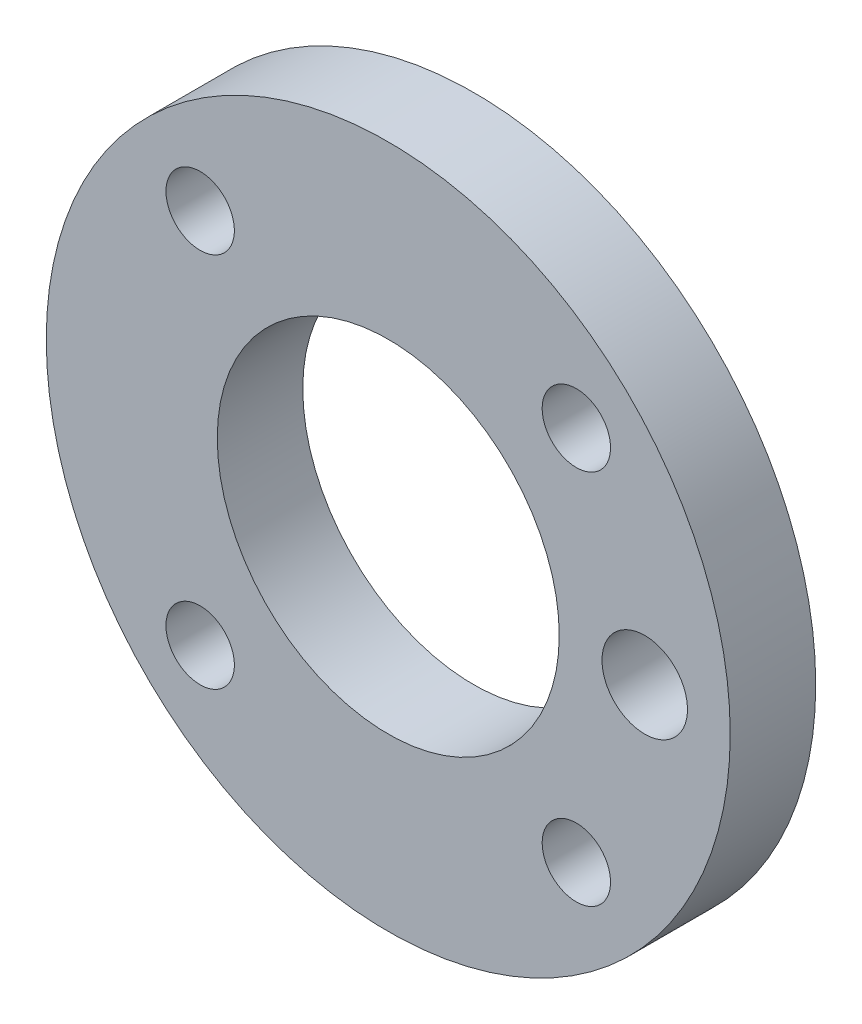
ISO-10303-21;
HEADER;
FILE_DESCRIPTION(('STEP AP214'),'2;1');
FILE_NAME('part.step','',(''),(''),'','','');
FILE_SCHEMA(('AUTOMOTIVE_DESIGN { 1 0 10303 214 1 1 1 1 }'));
ENDSEC;
DATA;
#1=APPLICATION_CONTEXT('core data for automotive mechanical design processes');
#2=APPLICATION_PROTOCOL_DEFINITION('international standard','automotive_design',2000,#1);
#3=PRODUCT_CONTEXT('',#1,'mechanical');
#4=PRODUCT('Part','Part','',(#3));
#5=PRODUCT_RELATED_PRODUCT_CATEGORY('part','',(#4));
#6=PRODUCT_DEFINITION_FORMATION('','',#4);
#7=PRODUCT_DEFINITION_CONTEXT('part definition',#1,'design');
#8=PRODUCT_DEFINITION('design','',#6,#7);
#9=PRODUCT_DEFINITION_SHAPE('','',#8);
#10=(LENGTH_UNIT() NAMED_UNIT(*) SI_UNIT(.MILLI.,.METRE.));
#11=(NAMED_UNIT(*) PLANE_ANGLE_UNIT() SI_UNIT($,.RADIAN.));
#12=(NAMED_UNIT(*) SI_UNIT($,.STERADIAN.) SOLID_ANGLE_UNIT());
#13=UNCERTAINTY_MEASURE_WITH_UNIT(LENGTH_MEASURE(1.E-05),#10,'distance_accuracy_value','');
#14=(GEOMETRIC_REPRESENTATION_CONTEXT(3) GLOBAL_UNCERTAINTY_ASSIGNED_CONTEXT((#13)) GLOBAL_UNIT_ASSIGNED_CONTEXT((#10,
#11,#12)) REPRESENTATION_CONTEXT('',''));
#15=CARTESIAN_POINT('',(0.,0.,0.));
#16=DIRECTION('',(0.,0.,1.));
#17=DIRECTION('',(1.,0.,0.));
#18=AXIS2_PLACEMENT_3D('',#15,#16,#17);
#19=CARTESIAN_POINT('',(0.,0.,5.));
#20=DIRECTION('',(0.,0.,1.));
#21=DIRECTION('',(-1.,0.,0.));
#22=AXIS2_PLACEMENT_3D('',#19,#20,#21);
#23=PLANE('',#22);
#24=CARTESIAN_POINT('',(-11.0000000000001,10.9999999999999,5.00000000000004));
#25=DIRECTION('',(0.,0.,1.));
#26=DIRECTION('',(-1.,0.,0.));
#27=AXIS2_PLACEMENT_3D('',#24,#25,#26);
#28=CIRCLE('',#27,2.);
#29=CARTESIAN_POINT('',(-13.0000000000001,10.9999999999999,5.00000000000005));
#30=VERTEX_POINT('',#29);
#31=EDGE_CURVE('E83',#30,#30,#28,.T.);
#32=ORIENTED_EDGE('',*,*,#31,.F.);
#33=EDGE_LOOP('',(#32));
#34=FACE_BOUND('',#33,.T.);
#35=CARTESIAN_POINT('',(15.,1.03163547985295E-13,4.99999999999995));
#36=DIRECTION('',(0.,0.,1.));
#37=DIRECTION('',(-1.,0.,0.));
#38=AXIS2_PLACEMENT_3D('',#35,#36,#37);
#39=CIRCLE('',#38,2.5);
#40=CARTESIAN_POINT('',(12.5,0.,4.99999999999996));
#41=VERTEX_POINT('',#40);
#42=EDGE_CURVE('E67',#41,#41,#39,.T.);
#43=ORIENTED_EDGE('',*,*,#42,.F.);
#44=EDGE_LOOP('',(#43));
#45=FACE_BOUND('',#44,.T.);
#46=CARTESIAN_POINT('',(0.,0.,5.));
#47=DIRECTION('',(0.,0.,1.));
#48=DIRECTION('',(-1.,0.,0.));
#49=AXIS2_PLACEMENT_3D('',#46,#47,#48);
#50=CIRCLE('',#49,10.);
#51=CARTESIAN_POINT('',(-9.99999999999998,0.,5.00000000000003));
#52=VERTEX_POINT('',#51);
#53=EDGE_CURVE('E53',#52,#52,#50,.T.);
#54=ORIENTED_EDGE('',*,*,#53,.F.);
#55=EDGE_LOOP('',(#54));
#56=FACE_BOUND('',#55,.T.);
#57=CARTESIAN_POINT('',(0.,0.,5.));
#58=DIRECTION('',(0.,0.,1.));
#59=DIRECTION('',(-1.,0.,0.));
#60=AXIS2_PLACEMENT_3D('',#57,#58,#59);
#61=CIRCLE('',#60,20.);
#62=CARTESIAN_POINT('',(-20.,-1.39659253553725E-13,5.00000000000007));
#63=VERTEX_POINT('',#62);
#64=EDGE_CURVE('E10',#63,#63,#61,.T.);
#65=ORIENTED_EDGE('',*,*,#64,.T.);
#66=EDGE_LOOP('',(#65));
#67=FACE_BOUND('',#66,.T.);
#68=CARTESIAN_POINT('',(11.0000000000001,-10.9999999999999,4.99999999999996));
#69=DIRECTION('',(0.,0.,1.));
#70=DIRECTION('',(-1.,0.,0.));
#71=AXIS2_PLACEMENT_3D('',#68,#69,#70);
#72=CIRCLE('',#71,2.);
#73=CARTESIAN_POINT('',(9.0000000000001,-10.9999999999999,4.99999999999997));
#74=VERTEX_POINT('',#73);
#75=EDGE_CURVE('E59',#74,#74,#72,.T.);
#76=ORIENTED_EDGE('',*,*,#75,.F.);
#77=EDGE_LOOP('',(#76));
#78=FACE_BOUND('',#77,.T.);
#79=CARTESIAN_POINT('',(-10.9999999999999,-11.0000000000001,5.00000000000004));
#80=DIRECTION('',(0.,0.,1.));
#81=DIRECTION('',(-1.,0.,0.));
#82=AXIS2_PLACEMENT_3D('',#79,#80,#81);
#83=CIRCLE('',#82,2.);
#84=CARTESIAN_POINT('',(-12.9999999999999,-11.0000000000001,5.00000000000005));
#85=VERTEX_POINT('',#84);
#86=EDGE_CURVE('E75',#85,#85,#83,.T.);
#87=ORIENTED_EDGE('',*,*,#86,.F.);
#88=EDGE_LOOP('',(#87));
#89=FACE_BOUND('',#88,.T.);
#90=CARTESIAN_POINT('',(10.9999999999999,11.0000000000001,4.99999999999996));
#91=DIRECTION('',(0.,0.,1.));
#92=DIRECTION('',(-1.,0.,0.));
#93=AXIS2_PLACEMENT_3D('',#90,#91,#92);
#94=CIRCLE('',#93,2.);
#95=CARTESIAN_POINT('',(8.99999999999994,11.0000000000001,4.99999999999997));
#96=VERTEX_POINT('',#95);
#97=EDGE_CURVE('E91',#96,#96,#94,.T.);
#98=ORIENTED_EDGE('',*,*,#97,.F.);
#99=EDGE_LOOP('',(#98));
#100=FACE_BOUND('',#99,.T.);
#101=ADVANCED_FACE('F40',(#34,#45,#56,#67,#78,#89,#100),#23,.T.);
#102=CARTESIAN_POINT('',(0.,0.,0.));
#103=DIRECTION('',(0.,0.,1.));
#104=DIRECTION('',(-1.,0.,0.));
#105=AXIS2_PLACEMENT_3D('',#102,#103,#104);
#106=PLANE('',#105);
#107=CARTESIAN_POINT('',(0.,0.,0.));
#108=DIRECTION('',(0.,0.,1.));
#109=DIRECTION('',(-1.,0.,0.));
#110=AXIS2_PLACEMENT_3D('',#107,#108,#109);
#111=CIRCLE('',#110,20.);
#112=CARTESIAN_POINT('',(-20.,-1.39659253553725E-13,0.));
#113=VERTEX_POINT('',#112);
#114=EDGE_CURVE('E44',#113,#113,#111,.T.);
#115=ORIENTED_EDGE('',*,*,#114,.F.);
#116=EDGE_LOOP('',(#115));
#117=FACE_BOUND('',#116,.T.);
#118=CARTESIAN_POINT('',(0.,0.,0.));
#119=DIRECTION('',(0.,0.,1.));
#120=DIRECTION('',(-1.,0.,0.));
#121=AXIS2_PLACEMENT_3D('',#118,#119,#120);
#122=CIRCLE('',#121,10.);
#123=CARTESIAN_POINT('',(-10.,0.,0.));
#124=VERTEX_POINT('',#123);
#125=EDGE_CURVE('E55',#124,#124,#122,.T.);
#126=ORIENTED_EDGE('',*,*,#125,.T.);
#127=EDGE_LOOP('',(#126));
#128=FACE_BOUND('',#127,.T.);
#129=CARTESIAN_POINT('',(11.0000000000001,-10.9999999999999,0.));
#130=DIRECTION('',(0.,0.,1.));
#131=DIRECTION('',(-1.,0.,0.));
#132=AXIS2_PLACEMENT_3D('',#129,#130,#131);
#133=CIRCLE('',#132,2.);
#134=CARTESIAN_POINT('',(9.00000000000008,-10.9999999999999,0.));
#135=VERTEX_POINT('',#134);
#136=EDGE_CURVE('E63',#135,#135,#133,.T.);
#137=ORIENTED_EDGE('',*,*,#136,.T.);
#138=EDGE_LOOP('',(#137));
#139=FACE_BOUND('',#138,.T.);
#140=CARTESIAN_POINT('',(15.,1.03163547985295E-13,0.));
#141=DIRECTION('',(0.,0.,1.));
#142=DIRECTION('',(-1.,0.,0.));
#143=AXIS2_PLACEMENT_3D('',#140,#141,#142);
#144=CIRCLE('',#143,2.5);
#145=CARTESIAN_POINT('',(12.5,0.,0.));
#146=VERTEX_POINT('',#145);
#147=EDGE_CURVE('E71',#146,#146,#144,.T.);
#148=ORIENTED_EDGE('',*,*,#147,.T.);
#149=EDGE_LOOP('',(#148));
#150=FACE_BOUND('',#149,.T.);
#151=CARTESIAN_POINT('',(-10.9999999999999,-11.0000000000001,0.));
#152=DIRECTION('',(0.,0.,1.));
#153=DIRECTION('',(-1.,0.,0.));
#154=AXIS2_PLACEMENT_3D('',#151,#152,#153);
#155=CIRCLE('',#154,2.);
#156=CARTESIAN_POINT('',(-12.9999999999999,-11.0000000000001,0.));
#157=VERTEX_POINT('',#156);
#158=EDGE_CURVE('E79',#157,#157,#155,.T.);
#159=ORIENTED_EDGE('',*,*,#158,.T.);
#160=EDGE_LOOP('',(#159));
#161=FACE_BOUND('',#160,.T.);
#162=CARTESIAN_POINT('',(-11.0000000000001,10.9999999999999,0.));
#163=DIRECTION('',(0.,0.,1.));
#164=DIRECTION('',(-1.,0.,0.));
#165=AXIS2_PLACEMENT_3D('',#162,#163,#164);
#166=CIRCLE('',#165,2.);
#167=CARTESIAN_POINT('',(-13.0000000000001,10.9999999999999,0.));
#168=VERTEX_POINT('',#167);
#169=EDGE_CURVE('E87',#168,#168,#166,.T.);
#170=ORIENTED_EDGE('',*,*,#169,.T.);
#171=EDGE_LOOP('',(#170));
#172=FACE_BOUND('',#171,.T.);
#173=CARTESIAN_POINT('',(10.9999999999999,11.0000000000001,0.));
#174=DIRECTION('',(0.,0.,1.));
#175=DIRECTION('',(-1.,0.,0.));
#176=AXIS2_PLACEMENT_3D('',#173,#174,#175);
#177=CIRCLE('',#176,2.);
#178=CARTESIAN_POINT('',(8.99999999999993,11.0000000000001,0.));
#179=VERTEX_POINT('',#178);
#180=EDGE_CURVE('E95',#179,#179,#177,.T.);
#181=ORIENTED_EDGE('',*,*,#180,.T.);
#182=EDGE_LOOP('',(#181));
#183=FACE_BOUND('',#182,.T.);
#184=ADVANCED_FACE('F107',(#117,#128,#139,#150,#161,#172,#183),#106,.F.);
#185=CARTESIAN_POINT('',(0.,0.,5.));
#186=DIRECTION('',(0.,0.,-1.));
#187=DIRECTION('',(1.,0.,0.));
#188=AXIS2_PLACEMENT_3D('',#185,#186,#187);
#189=CYLINDRICAL_SURFACE('',#188,20.);
#190=ORIENTED_EDGE('',*,*,#64,.F.);
#191=EDGE_LOOP('',(#190));
#192=FACE_BOUND('',#191,.T.);
#193=ORIENTED_EDGE('',*,*,#114,.T.);
#194=EDGE_LOOP('',(#193));
#195=FACE_BOUND('',#194,.T.);
#196=ADVANCED_FACE('F42',(#192,#195),#189,.T.);
#197=CARTESIAN_POINT('',(0.,0.,5.));
#198=DIRECTION('',(0.,0.,-1.));
#199=DIRECTION('',(1.,0.,0.));
#200=AXIS2_PLACEMENT_3D('',#197,#198,#199);
#201=CYLINDRICAL_SURFACE('',#200,10.);
#202=ORIENTED_EDGE('',*,*,#53,.T.);
#203=EDGE_LOOP('',(#202));
#204=FACE_BOUND('',#203,.T.);
#205=ORIENTED_EDGE('',*,*,#125,.F.);
#206=EDGE_LOOP('',(#205));
#207=FACE_BOUND('',#206,.T.);
#208=ADVANCED_FACE('F117',(#204,#207),#201,.F.);
#209=CARTESIAN_POINT('',(11.0000000000001,-10.9999999999999,4.99999999999996));
#210=DIRECTION('',(0.,0.,-1.));
#211=DIRECTION('',(1.,0.,0.));
#212=AXIS2_PLACEMENT_3D('',#209,#210,#211);
#213=CYLINDRICAL_SURFACE('',#212,2.);
#214=ORIENTED_EDGE('',*,*,#75,.T.);
#215=EDGE_LOOP('',(#214));
#216=FACE_BOUND('',#215,.T.);
#217=ORIENTED_EDGE('',*,*,#136,.F.);
#218=EDGE_LOOP('',(#217));
#219=FACE_BOUND('',#218,.T.);
#220=ADVANCED_FACE('F120',(#216,#219),#213,.F.);
#221=CARTESIAN_POINT('',(15.,1.03163547985295E-13,4.99999999999995));
#222=DIRECTION('',(0.,0.,-1.));
#223=DIRECTION('',(1.,0.,0.));
#224=AXIS2_PLACEMENT_3D('',#221,#222,#223);
#225=CYLINDRICAL_SURFACE('',#224,2.5);
#226=ORIENTED_EDGE('',*,*,#42,.T.);
#227=EDGE_LOOP('',(#226));
#228=FACE_BOUND('',#227,.T.);
#229=ORIENTED_EDGE('',*,*,#147,.F.);
#230=EDGE_LOOP('',(#229));
#231=FACE_BOUND('',#230,.T.);
#232=ADVANCED_FACE('F124',(#228,#231),#225,.F.);
#233=CARTESIAN_POINT('',(-10.9999999999999,-11.0000000000001,5.00000000000004));
#234=DIRECTION('',(0.,0.,-1.));
#235=DIRECTION('',(1.,0.,0.));
#236=AXIS2_PLACEMENT_3D('',#233,#234,#235);
#237=CYLINDRICAL_SURFACE('',#236,2.);
#238=ORIENTED_EDGE('',*,*,#86,.T.);
#239=EDGE_LOOP('',(#238));
#240=FACE_BOUND('',#239,.T.);
#241=ORIENTED_EDGE('',*,*,#158,.F.);
#242=EDGE_LOOP('',(#241));
#243=FACE_BOUND('',#242,.T.);
#244=ADVANCED_FACE('F128',(#240,#243),#237,.F.);
#245=CARTESIAN_POINT('',(-11.0000000000001,10.9999999999999,5.00000000000004));
#246=DIRECTION('',(0.,0.,-1.));
#247=DIRECTION('',(1.,0.,0.));
#248=AXIS2_PLACEMENT_3D('',#245,#246,#247);
#249=CYLINDRICAL_SURFACE('',#248,2.);
#250=ORIENTED_EDGE('',*,*,#31,.T.);
#251=EDGE_LOOP('',(#250));
#252=FACE_BOUND('',#251,.T.);
#253=ORIENTED_EDGE('',*,*,#169,.F.);
#254=EDGE_LOOP('',(#253));
#255=FACE_BOUND('',#254,.T.);
#256=ADVANCED_FACE('F132',(#252,#255),#249,.F.);
#257=CARTESIAN_POINT('',(10.9999999999999,11.0000000000001,4.99999999999996));
#258=DIRECTION('',(0.,0.,-1.));
#259=DIRECTION('',(1.,0.,0.));
#260=AXIS2_PLACEMENT_3D('',#257,#258,#259);
#261=CYLINDRICAL_SURFACE('',#260,2.);
#262=ORIENTED_EDGE('',*,*,#97,.T.);
#263=EDGE_LOOP('',(#262));
#264=FACE_BOUND('',#263,.T.);
#265=ORIENTED_EDGE('',*,*,#180,.F.);
#266=EDGE_LOOP('',(#265));
#267=FACE_BOUND('',#266,.T.);
#268=ADVANCED_FACE('F103',(#264,#267),#261,.F.);
#269=CLOSED_SHELL('',(#101,#184,#196,#208,#220,#232,#244,#256,#268));
#270=MANIFOLD_SOLID_BREP('B2',#269);
#271=ADVANCED_BREP_SHAPE_REPRESENTATION('',(#18,#270),#14);
#272=SHAPE_DEFINITION_REPRESENTATION(#9,#271);
ENDSEC;
END-ISO-10303-21;
